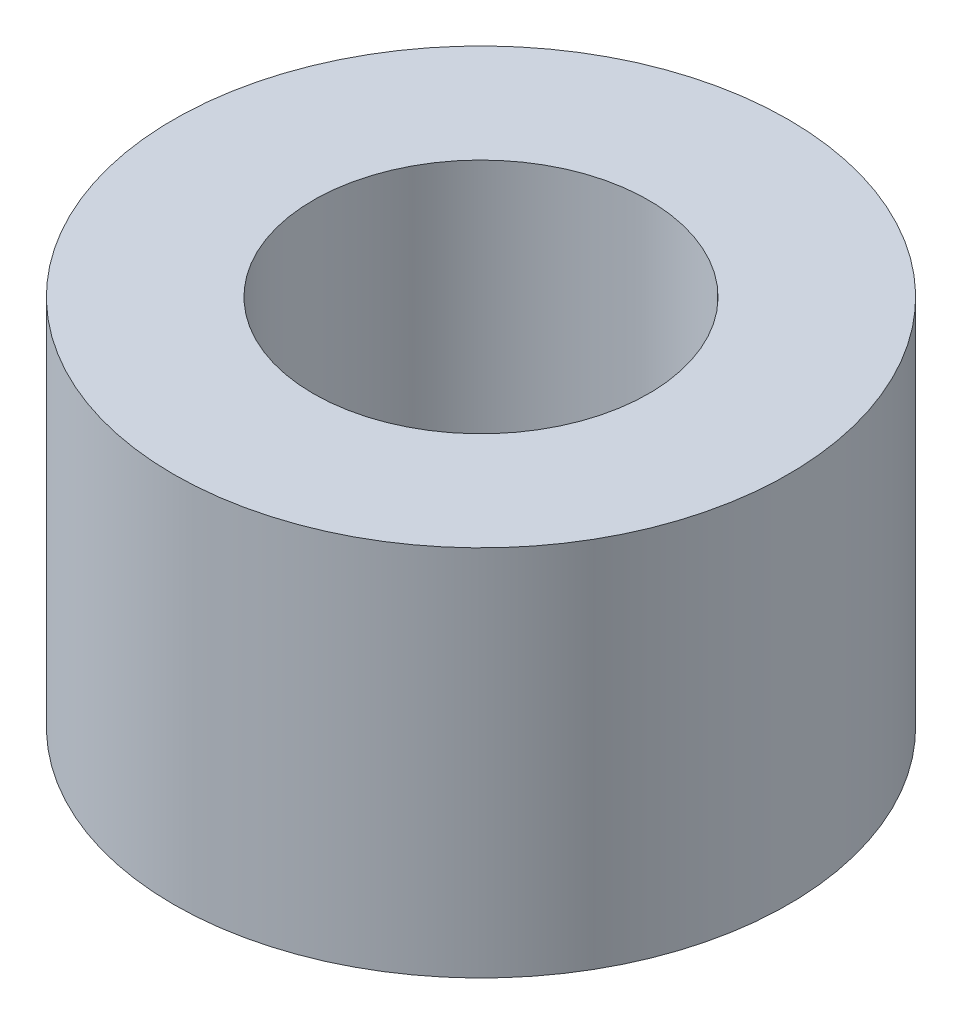
ISO-10303-21;
HEADER;
FILE_DESCRIPTION(('STEP AP214'),'2;1');
FILE_NAME('part.step','',(''),(''),'','','');
FILE_SCHEMA(('AUTOMOTIVE_DESIGN { 1 0 10303 214 1 1 1 1 }'));
ENDSEC;
DATA;
#1=APPLICATION_CONTEXT('core data for automotive mechanical design processes');
#2=APPLICATION_PROTOCOL_DEFINITION('international standard','automotive_design',2000,#1);
#3=PRODUCT_CONTEXT('',#1,'mechanical');
#4=PRODUCT('Part','Part','',(#3));
#5=PRODUCT_RELATED_PRODUCT_CATEGORY('part','',(#4));
#6=PRODUCT_DEFINITION_FORMATION('','',#4);
#7=PRODUCT_DEFINITION_CONTEXT('part definition',#1,'design');
#8=PRODUCT_DEFINITION('design','',#6,#7);
#9=PRODUCT_DEFINITION_SHAPE('','',#8);
#10=(LENGTH_UNIT() NAMED_UNIT(*) SI_UNIT(.MILLI.,.METRE.));
#11=(NAMED_UNIT(*) PLANE_ANGLE_UNIT() SI_UNIT($,.RADIAN.));
#12=(NAMED_UNIT(*) SI_UNIT($,.STERADIAN.) SOLID_ANGLE_UNIT());
#13=UNCERTAINTY_MEASURE_WITH_UNIT(LENGTH_MEASURE(1.E-05),#10,'distance_accuracy_value','');
#14=(GEOMETRIC_REPRESENTATION_CONTEXT(3) GLOBAL_UNCERTAINTY_ASSIGNED_CONTEXT((#13)) GLOBAL_UNIT_ASSIGNED_CONTEXT((#10,
#11,#12)) REPRESENTATION_CONTEXT('',''));
#15=CARTESIAN_POINT('',(0.,0.,0.));
#16=DIRECTION('',(0.,0.,1.));
#17=DIRECTION('',(1.,0.,0.));
#18=AXIS2_PLACEMENT_3D('',#15,#16,#17);
#19=CARTESIAN_POINT('',(0.,4.,0.));
#20=DIRECTION('',(0.,1.,0.));
#21=DIRECTION('',(0.,0.,1.));
#22=AXIS2_PLACEMENT_3D('',#19,#20,#21);
#23=PLANE('',#22);
#24=CARTESIAN_POINT('',(0.,4.,0.));
#25=DIRECTION('',(0.,1.,0.));
#26=DIRECTION('',(0.,0.,1.));
#27=AXIS2_PLACEMENT_3D('',#24,#25,#26);
#28=CIRCLE('',#27,3.3);
#29=CARTESIAN_POINT('',(0.,4.,3.3));
#30=VERTEX_POINT('',#29);
#31=EDGE_CURVE('E10',#30,#30,#28,.T.);
#32=ORIENTED_EDGE('',*,*,#31,.T.);
#33=EDGE_LOOP('',(#32));
#34=FACE_BOUND('',#33,.T.);
#35=CARTESIAN_POINT('',(0.,4.,0.));
#36=DIRECTION('',(0.,1.,0.));
#37=DIRECTION('',(0.,0.,1.));
#38=AXIS2_PLACEMENT_3D('',#35,#36,#37);
#39=CIRCLE('',#38,1.8);
#40=CARTESIAN_POINT('',(0.,4.,1.8));
#41=VERTEX_POINT('',#40);
#42=EDGE_CURVE('E56',#41,#41,#39,.T.);
#43=ORIENTED_EDGE('',*,*,#42,.F.);
#44=EDGE_LOOP('',(#43));
#45=FACE_BOUND('',#44,.T.);
#46=ADVANCED_FACE('F43',(#34,#45),#23,.T.);
#47=CARTESIAN_POINT('',(0.,0.,0.));
#48=DIRECTION('',(0.,1.,0.));
#49=DIRECTION('',(0.,0.,1.));
#50=AXIS2_PLACEMENT_3D('',#47,#48,#49);
#51=PLANE('',#50);
#52=CARTESIAN_POINT('',(0.,0.,0.));
#53=DIRECTION('',(0.,1.,0.));
#54=DIRECTION('',(0.,0.,1.));
#55=AXIS2_PLACEMENT_3D('',#52,#53,#54);
#56=CIRCLE('',#55,3.3);
#57=CARTESIAN_POINT('',(0.,0.,3.3));
#58=VERTEX_POINT('',#57);
#59=EDGE_CURVE('E47',#58,#58,#56,.T.);
#60=ORIENTED_EDGE('',*,*,#59,.F.);
#61=EDGE_LOOP('',(#60));
#62=FACE_BOUND('',#61,.T.);
#63=CARTESIAN_POINT('',(0.,0.,0.));
#64=DIRECTION('',(0.,1.,0.));
#65=DIRECTION('',(0.,0.,1.));
#66=AXIS2_PLACEMENT_3D('',#63,#64,#65);
#67=CIRCLE('',#66,1.8);
#68=CARTESIAN_POINT('',(0.,0.,1.8));
#69=VERTEX_POINT('',#68);
#70=EDGE_CURVE('E58',#69,#69,#67,.T.);
#71=ORIENTED_EDGE('',*,*,#70,.T.);
#72=EDGE_LOOP('',(#71));
#73=FACE_BOUND('',#72,.T.);
#74=ADVANCED_FACE('F70',(#62,#73),#51,.F.);
#75=CARTESIAN_POINT('',(0.,4.,0.));
#76=DIRECTION('',(0.,-1.,0.));
#77=DIRECTION('',(0.,0.,-1.));
#78=AXIS2_PLACEMENT_3D('',#75,#76,#77);
#79=CYLINDRICAL_SURFACE('',#78,3.3);
#80=ORIENTED_EDGE('',*,*,#31,.F.);
#81=EDGE_LOOP('',(#80));
#82=FACE_BOUND('',#81,.T.);
#83=ORIENTED_EDGE('',*,*,#59,.T.);
#84=EDGE_LOOP('',(#83));
#85=FACE_BOUND('',#84,.T.);
#86=ADVANCED_FACE('F45',(#82,#85),#79,.T.);
#87=CARTESIAN_POINT('',(0.,4.,0.));
#88=DIRECTION('',(0.,-1.,0.));
#89=DIRECTION('',(0.,0.,-1.));
#90=AXIS2_PLACEMENT_3D('',#87,#88,#89);
#91=CYLINDRICAL_SURFACE('',#90,1.8);
#92=ORIENTED_EDGE('',*,*,#42,.T.);
#93=EDGE_LOOP('',(#92));
#94=FACE_BOUND('',#93,.T.);
#95=ORIENTED_EDGE('',*,*,#70,.F.);
#96=EDGE_LOOP('',(#95));
#97=FACE_BOUND('',#96,.T.);
#98=ADVANCED_FACE('F66',(#94,#97),#91,.F.);
#99=CLOSED_SHELL('',(#46,#74,#86,#98));
#100=MANIFOLD_SOLID_BREP('B2',#99);
#101=ADVANCED_BREP_SHAPE_REPRESENTATION('',(#18,#100),#14);
#102=SHAPE_DEFINITION_REPRESENTATION(#9,#101);
ENDSEC;
END-ISO-10303-21;
